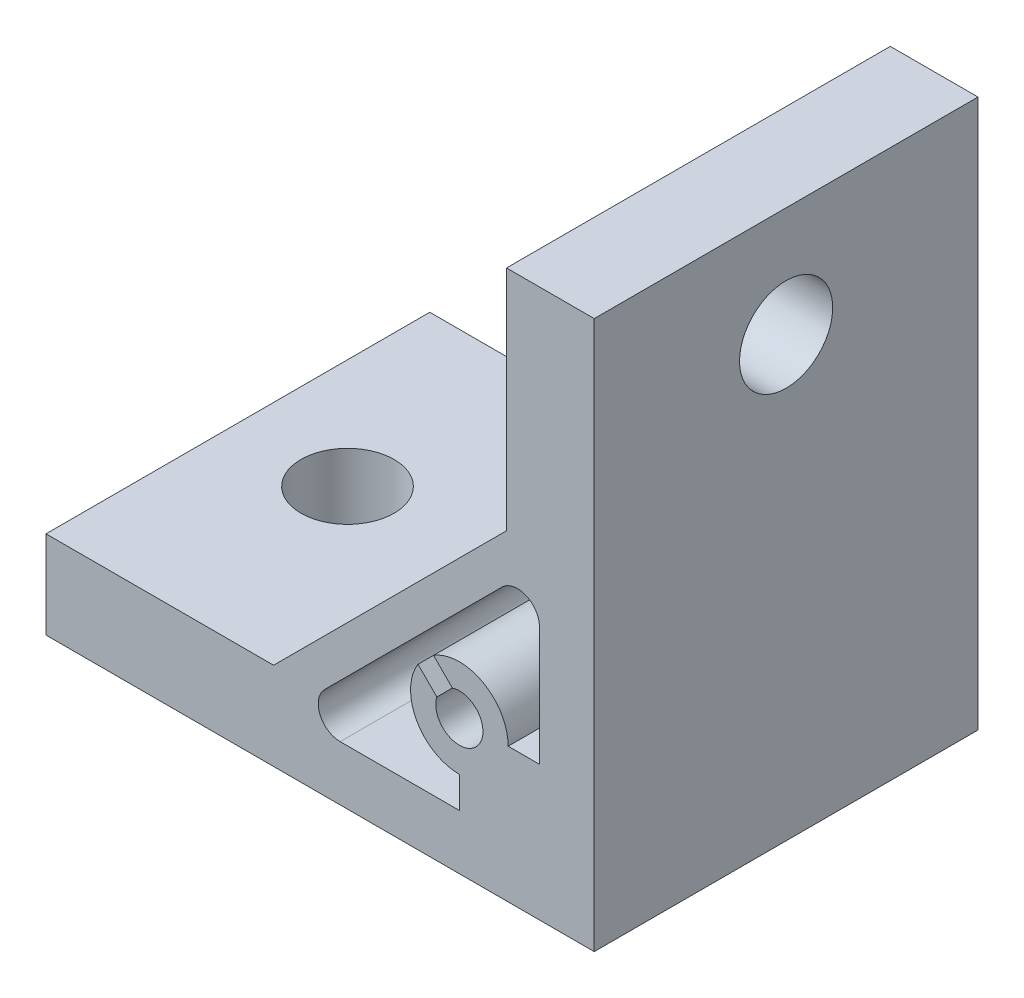
ISO-10303-21;
HEADER;
FILE_DESCRIPTION(('STEP AP214'),'2;1');
FILE_NAME('part.step','',(''),(''),'','','');
FILE_SCHEMA(('AUTOMOTIVE_DESIGN { 1 0 10303 214 1 1 1 1 }'));
ENDSEC;
DATA;
#1=APPLICATION_CONTEXT('core data for automotive mechanical design processes');
#2=APPLICATION_PROTOCOL_DEFINITION('international standard','automotive_design',2000,#1);
#3=PRODUCT_CONTEXT('',#1,'mechanical');
#4=PRODUCT('Part','Part','',(#3));
#5=PRODUCT_RELATED_PRODUCT_CATEGORY('part','',(#4));
#6=PRODUCT_DEFINITION_FORMATION('','',#4);
#7=PRODUCT_DEFINITION_CONTEXT('part definition',#1,'design');
#8=PRODUCT_DEFINITION('design','',#6,#7);
#9=PRODUCT_DEFINITION_SHAPE('','',#8);
#10=(LENGTH_UNIT() NAMED_UNIT(*) SI_UNIT(.MILLI.,.METRE.));
#11=(NAMED_UNIT(*) PLANE_ANGLE_UNIT() SI_UNIT($,.RADIAN.));
#12=(NAMED_UNIT(*) SI_UNIT($,.STERADIAN.) SOLID_ANGLE_UNIT());
#13=UNCERTAINTY_MEASURE_WITH_UNIT(LENGTH_MEASURE(1.E-05),#10,'distance_accuracy_value','');
#14=(GEOMETRIC_REPRESENTATION_CONTEXT(3) GLOBAL_UNCERTAINTY_ASSIGNED_CONTEXT((#13)) GLOBAL_UNIT_ASSIGNED_CONTEXT((#10,
#11,#12)) REPRESENTATION_CONTEXT('',''));
#15=CARTESIAN_POINT('',(0.,0.,0.));
#16=DIRECTION('',(0.,0.,1.));
#17=DIRECTION('',(1.,0.,0.));
#18=AXIS2_PLACEMENT_3D('',#15,#16,#17);
#19=CARTESIAN_POINT('',(50.,0.,17.5));
#20=DIRECTION('',(-1.,0.,0.));
#21=DIRECTION('',(0.,0.,1.));
#22=AXIS2_PLACEMENT_3D('',#19,#20,#21);
#23=PLANE('',#22);
#24=DIRECTION('',(0.,1.,0.));
#25=VECTOR('',#24,1.);
#26=CARTESIAN_POINT('',(50.,0.,-17.5));
#27=LINE('',#26,#25);
#28=CARTESIAN_POINT('',(50.,0.,-17.5));
#29=VERTEX_POINT('',#28);
#30=CARTESIAN_POINT('',(50.,50.,-17.5));
#31=VERTEX_POINT('',#30);
#32=EDGE_CURVE('E283',#29,#31,#27,.T.);
#33=ORIENTED_EDGE('',*,*,#32,.T.);
#34=DIRECTION('',(0.,0.,-1.));
#35=VECTOR('',#34,1.);
#36=CARTESIAN_POINT('',(50.,50.,17.5));
#37=LINE('',#36,#35);
#38=CARTESIAN_POINT('',(50.,50.,17.5));
#39=VERTEX_POINT('',#38);
#40=EDGE_CURVE('E303',#39,#31,#37,.T.);
#41=ORIENTED_EDGE('',*,*,#40,.F.);
#42=DIRECTION('',(0.,1.,0.));
#43=VECTOR('',#42,1.);
#44=CARTESIAN_POINT('',(50.,0.,17.5));
#45=LINE('',#44,#43);
#46=CARTESIAN_POINT('',(50.,0.,17.5));
#47=VERTEX_POINT('',#46);
#48=EDGE_CURVE('E268',#47,#39,#45,.T.);
#49=ORIENTED_EDGE('',*,*,#48,.F.);
#50=DIRECTION('',(0.,0.,-1.));
#51=VECTOR('',#50,1.);
#52=CARTESIAN_POINT('',(50.,0.,17.5));
#53=LINE('',#52,#51);
#54=EDGE_CURVE('E43',#47,#29,#53,.T.);
#55=ORIENTED_EDGE('',*,*,#54,.T.);
#56=EDGE_LOOP('',(#33,#41,#49,#55));
#57=FACE_BOUND('',#56,.T.);
#58=CARTESIAN_POINT('',(50.0000000000001,40.,0.));
#59=DIRECTION('',(1.,0.,0.));
#60=DIRECTION('',(0.,0.,1.));
#61=AXIS2_PLACEMENT_3D('',#58,#59,#60);
#62=CIRCLE('',#61,4.25);
#63=CARTESIAN_POINT('',(50.0000000000001,40.,4.25));
#64=VERTEX_POINT('',#63);
#65=EDGE_CURVE('E369',#64,#64,#62,.T.);
#66=ORIENTED_EDGE('',*,*,#65,.F.);
#67=EDGE_LOOP('',(#66));
#68=FACE_BOUND('',#67,.T.);
#69=ADVANCED_FACE('F35',(#57,#68),#23,.F.);
#70=CARTESIAN_POINT('',(42.,29.2426406871192,17.5));
#71=DIRECTION('',(1.,0.,0.));
#72=DIRECTION('',(0.,0.,-1.));
#73=AXIS2_PLACEMENT_3D('',#70,#71,#72);
#74=PLANE('',#73);
#75=DIRECTION('',(0.,-1.,0.));
#76=VECTOR('',#75,1.);
#77=CARTESIAN_POINT('',(42.,29.2426406871192,-17.5));
#78=LINE('',#77,#76);
#79=CARTESIAN_POINT('',(42.,50.,-17.5));
#80=VERTEX_POINT('',#79);
#81=CARTESIAN_POINT('',(42.,29.2426406871192,-17.5));
#82=VERTEX_POINT('',#81);
#83=EDGE_CURVE('E287',#80,#82,#78,.T.);
#84=ORIENTED_EDGE('',*,*,#83,.T.);
#85=DIRECTION('',(0.,0.,-1.));
#86=VECTOR('',#85,1.);
#87=CARTESIAN_POINT('',(42.,29.2426406871192,17.5));
#88=LINE('',#87,#86);
#89=CARTESIAN_POINT('',(42.,29.2426406871192,17.5));
#90=VERTEX_POINT('',#89);
#91=EDGE_CURVE('E297',#90,#82,#88,.T.);
#92=ORIENTED_EDGE('',*,*,#91,.F.);
#93=DIRECTION('',(0.,-1.,0.));
#94=VECTOR('',#93,1.);
#95=CARTESIAN_POINT('',(42.,29.2426406871192,17.5));
#96=LINE('',#95,#94);
#97=CARTESIAN_POINT('',(42.,50.,17.5));
#98=VERTEX_POINT('',#97);
#99=EDGE_CURVE('E272',#98,#90,#96,.T.);
#100=ORIENTED_EDGE('',*,*,#99,.F.);
#101=DIRECTION('',(0.,0.,-1.));
#102=VECTOR('',#101,1.);
#103=CARTESIAN_POINT('',(42.,50.,17.5));
#104=LINE('',#103,#102);
#105=EDGE_CURVE('E300',#98,#80,#104,.T.);
#106=ORIENTED_EDGE('',*,*,#105,.T.);
#107=EDGE_LOOP('',(#84,#92,#100,#106));
#108=FACE_BOUND('',#107,.T.);
#109=CARTESIAN_POINT('',(42.0000000000001,40.,0.));
#110=DIRECTION('',(1.,0.,0.));
#111=DIRECTION('',(0.,0.,1.));
#112=AXIS2_PLACEMENT_3D('',#109,#110,#111);
#113=CIRCLE('',#112,4.25);
#114=CARTESIAN_POINT('',(42.0000000000001,40.,4.25));
#115=VERTEX_POINT('',#114);
#116=EDGE_CURVE('E371',#115,#115,#113,.T.);
#117=ORIENTED_EDGE('',*,*,#116,.T.);
#118=EDGE_LOOP('',(#117));
#119=FACE_BOUND('',#118,.T.);
#120=ADVANCED_FACE('F326',(#108,#119),#74,.F.);
#121=CARTESIAN_POINT('',(0.,0.,17.5));
#122=DIRECTION('',(0.,0.,1.));
#123=DIRECTION('',(1.,0.,0.));
#124=AXIS2_PLACEMENT_3D('',#121,#122,#123);
#125=PLANE('',#124);
#126=DIRECTION('',(0.,-1.,0.));
#127=VECTOR('',#126,1.);
#128=CARTESIAN_POINT('',(0.,8.,17.5));
#129=LINE('',#128,#127);
#130=CARTESIAN_POINT('',(0.,8.,17.5));
#131=VERTEX_POINT('',#130);
#132=CARTESIAN_POINT('',(0.,0.,17.5));
#133=VERTEX_POINT('',#132);
#134=EDGE_CURVE('E262',#131,#133,#129,.T.);
#135=ORIENTED_EDGE('',*,*,#134,.T.);
#136=DIRECTION('',(1.,0.,0.));
#137=VECTOR('',#136,1.);
#138=CARTESIAN_POINT('',(0.,0.,17.5));
#139=LINE('',#138,#137);
#140=EDGE_CURVE('E265',#133,#47,#139,.T.);
#141=ORIENTED_EDGE('',*,*,#140,.T.);
#142=ORIENTED_EDGE('',*,*,#48,.T.);
#143=DIRECTION('',(-1.,0.,0.));
#144=VECTOR('',#143,1.);
#145=CARTESIAN_POINT('',(42.,50.,17.5));
#146=LINE('',#145,#144);
#147=EDGE_CURVE('E270',#39,#98,#146,.T.);
#148=ORIENTED_EDGE('',*,*,#147,.T.);
#149=ORIENTED_EDGE('',*,*,#99,.T.);
#150=DIRECTION('',(-0.707106781186546,-0.707106781186549,0.));
#151=VECTOR('',#150,1.);
#152=CARTESIAN_POINT('',(20.7573593128809,8.,17.5));
#153=LINE('',#152,#151);
#154=CARTESIAN_POINT('',(20.7573593128809,8.,17.5));
#155=VERTEX_POINT('',#154);
#156=EDGE_CURVE('E274',#90,#155,#153,.T.);
#157=ORIENTED_EDGE('',*,*,#156,.T.);
#158=DIRECTION('',(-1.,0.,0.));
#159=VECTOR('',#158,1.);
#160=CARTESIAN_POINT('',(0.,8.,17.5));
#161=LINE('',#160,#159);
#162=EDGE_CURVE('E276',#155,#131,#161,.T.);
#163=ORIENTED_EDGE('',*,*,#162,.T.);
#164=EDGE_LOOP('',(#135,#141,#142,#148,#149,#157,#163));
#165=FACE_BOUND('',#164,.T.);
#166=DIRECTION('',(0.707106781186549,-0.707106781186546,0.));
#167=VECTOR('',#166,1.);
#168=CARTESIAN_POINT('',(35.647066335444,12.9387201021829,17.5));
#169=LINE('',#168,#167);
#170=CARTESIAN_POINT('',(33.9267474297161,14.6590390079109,17.5));
#171=VERTEX_POINT('',#170);
#172=CARTESIAN_POINT('',(35.647066335444,12.9387201021829,17.5));
#173=VERTEX_POINT('',#172);
#174=EDGE_CURVE('E174',#171,#173,#169,.T.);
#175=ORIENTED_EDGE('',*,*,#174,.F.);
#176=CARTESIAN_POINT('',(37.7,12.3,17.5));
#177=DIRECTION('',(0.,0.,-1.));
#178=DIRECTION('',(1.,0.,0.));
#179=AXIS2_PLACEMENT_3D('',#176,#177,#178);
#180=CIRCLE('',#179,4.45);
#181=CARTESIAN_POINT('',(37.7,7.84999999999995,17.5));
#182=VERTEX_POINT('',#181);
#183=EDGE_CURVE('E166',#182,#171,#180,.T.);
#184=ORIENTED_EDGE('',*,*,#183,.F.);
#185=DIRECTION('',(0.,1.,0.));
#186=VECTOR('',#185,1.);
#187=CARTESIAN_POINT('',(37.7,5.,17.5));
#188=LINE('',#187,#186);
#189=CARTESIAN_POINT('',(37.7,5.,17.5));
#190=VERTEX_POINT('',#189);
#191=EDGE_CURVE('E209',#190,#182,#188,.T.);
#192=ORIENTED_EDGE('',*,*,#191,.F.);
#193=DIRECTION('',(1.,0.,0.));
#194=VECTOR('',#193,1.);
#195=CARTESIAN_POINT('',(26.828427124746,5.,17.5));
#196=LINE('',#195,#194);
#197=CARTESIAN_POINT('',(26.828427124746,4.99999999999993,17.5));
#198=VERTEX_POINT('',#197);
#199=EDGE_CURVE('E207',#198,#190,#196,.T.);
#200=ORIENTED_EDGE('',*,*,#199,.F.);
#201=CARTESIAN_POINT('',(26.8284271247464,7.00000000000011,17.5));
#202=DIRECTION('',(0.,0.,1.));
#203=DIRECTION('',(1.,0.,0.));
#204=AXIS2_PLACEMENT_3D('',#201,#202,#203);
#205=CIRCLE('',#204,2.00000000000019);
#206=CARTESIAN_POINT('',(25.4142135623729,8.41421356237311,17.5));
#207=VERTEX_POINT('',#206);
#208=EDGE_CURVE('E205',#207,#198,#205,.T.);
#209=ORIENTED_EDGE('',*,*,#208,.F.);
#210=DIRECTION('',(-0.70710678118655,-0.707106781186545,0.));
#211=VECTOR('',#210,1.);
#212=CARTESIAN_POINT('',(25.4142135623729,8.41421356237311,17.5));
#213=LINE('',#212,#211);
#214=CARTESIAN_POINT('',(41.585786437627,24.5857864376269,17.5));
#215=VERTEX_POINT('',#214);
#216=EDGE_CURVE('E203',#215,#207,#213,.T.);
#217=ORIENTED_EDGE('',*,*,#216,.F.);
#218=CARTESIAN_POINT('',(43.0000000000002,23.171572875254,17.5));
#219=DIRECTION('',(0.,0.,1.));
#220=DIRECTION('',(1.,0.,0.));
#221=AXIS2_PLACEMENT_3D('',#218,#219,#220);
#222=CIRCLE('',#221,1.99999999999993);
#223=CARTESIAN_POINT('',(45.,23.1715728752539,17.5));
#224=VERTEX_POINT('',#223);
#225=EDGE_CURVE('E201',#224,#215,#222,.T.);
#226=ORIENTED_EDGE('',*,*,#225,.F.);
#227=DIRECTION('',(0.,1.,0.));
#228=VECTOR('',#227,1.);
#229=CARTESIAN_POINT('',(45.,23.1715728752539,17.5));
#230=LINE('',#229,#228);
#231=CARTESIAN_POINT('',(45.,12.3,17.5));
#232=VERTEX_POINT('',#231);
#233=EDGE_CURVE('E199',#232,#224,#230,.T.);
#234=ORIENTED_EDGE('',*,*,#233,.F.);
#235=DIRECTION('',(1.,0.,0.));
#236=VECTOR('',#235,1.);
#237=CARTESIAN_POINT('',(42.15,12.3,17.5));
#238=LINE('',#237,#236);
#239=CARTESIAN_POINT('',(42.15,12.3,17.5));
#240=VERTEX_POINT('',#239);
#241=EDGE_CURVE('E197',#240,#232,#238,.T.);
#242=ORIENTED_EDGE('',*,*,#241,.F.);
#243=CARTESIAN_POINT('',(37.7,12.3,17.5));
#244=DIRECTION('',(0.,0.,-1.));
#245=DIRECTION('',(1.,0.,0.));
#246=AXIS2_PLACEMENT_3D('',#243,#244,#245);
#247=CIRCLE('',#246,4.45);
#248=CARTESIAN_POINT('',(35.3409609920885,16.0732525702836,17.5));
#249=VERTEX_POINT('',#248);
#250=EDGE_CURVE('E195',#249,#240,#247,.T.);
#251=ORIENTED_EDGE('',*,*,#250,.F.);
#252=DIRECTION('',(-0.707106781186684,0.707106781186411,0.));
#253=VECTOR('',#252,1.);
#254=CARTESIAN_POINT('',(37.0612798978168,14.3529336645559,17.5));
#255=LINE('',#254,#253);
#256=CARTESIAN_POINT('',(37.0612798978168,14.3529336645559,17.5));
#257=VERTEX_POINT('',#256);
#258=EDGE_CURVE('E190',#257,#249,#255,.T.);
#259=ORIENTED_EDGE('',*,*,#258,.F.);
#260=CARTESIAN_POINT('',(37.7,12.3,17.5));
#261=DIRECTION('',(0.,0.,1.));
#262=DIRECTION('',(1.,0.,0.));
#263=AXIS2_PLACEMENT_3D('',#260,#261,#262);
#264=CIRCLE('',#263,2.15);
#265=EDGE_CURVE('E188',#173,#257,#264,.T.);
#266=ORIENTED_EDGE('',*,*,#265,.F.);
#267=EDGE_LOOP('',(#175,#184,#192,#200,#209,#217,#226,#234,#242,#251,#259,#266));
#268=FACE_BOUND('',#267,.T.);
#269=ADVANCED_FACE('F186',(#165,#268),#125,.T.);
#270=CARTESIAN_POINT('',(0.,0.,-17.5));
#271=DIRECTION('',(0.,0.,1.));
#272=DIRECTION('',(1.,0.,0.));
#273=AXIS2_PLACEMENT_3D('',#270,#271,#272);
#274=PLANE('',#273);
#275=DIRECTION('',(0.,-1.,0.));
#276=VECTOR('',#275,1.);
#277=CARTESIAN_POINT('',(0.,8.,-17.5));
#278=LINE('',#277,#276);
#279=CARTESIAN_POINT('',(0.,8.,-17.5));
#280=VERTEX_POINT('',#279);
#281=CARTESIAN_POINT('',(0.,0.,-17.5));
#282=VERTEX_POINT('',#281);
#283=EDGE_CURVE('E182',#280,#282,#278,.T.);
#284=ORIENTED_EDGE('',*,*,#283,.F.);
#285=DIRECTION('',(-1.,0.,0.));
#286=VECTOR('',#285,1.);
#287=CARTESIAN_POINT('',(0.,8.,-17.5));
#288=LINE('',#287,#286);
#289=CARTESIAN_POINT('',(20.7573593128809,8.,-17.5));
#290=VERTEX_POINT('',#289);
#291=EDGE_CURVE('E266',#290,#280,#288,.T.);
#292=ORIENTED_EDGE('',*,*,#291,.F.);
#293=DIRECTION('',(-0.707106781186546,-0.707106781186549,0.));
#294=VECTOR('',#293,1.);
#295=CARTESIAN_POINT('',(20.7573593128809,8.,-17.5));
#296=LINE('',#295,#294);
#297=EDGE_CURVE('E289',#82,#290,#296,.T.);
#298=ORIENTED_EDGE('',*,*,#297,.F.);
#299=ORIENTED_EDGE('',*,*,#83,.F.);
#300=DIRECTION('',(-1.,0.,0.));
#301=VECTOR('',#300,1.);
#302=CARTESIAN_POINT('',(42.,50.,-17.5));
#303=LINE('',#302,#301);
#304=EDGE_CURVE('E285',#31,#80,#303,.T.);
#305=ORIENTED_EDGE('',*,*,#304,.F.);
#306=ORIENTED_EDGE('',*,*,#32,.F.);
#307=DIRECTION('',(1.,0.,0.));
#308=VECTOR('',#307,1.);
#309=CARTESIAN_POINT('',(0.,0.,-17.5));
#310=LINE('',#309,#308);
#311=EDGE_CURVE('E281',#282,#29,#310,.T.);
#312=ORIENTED_EDGE('',*,*,#311,.F.);
#313=EDGE_LOOP('',(#284,#292,#298,#299,#305,#306,#312));
#314=FACE_BOUND('',#313,.T.);
#315=CARTESIAN_POINT('',(37.7,12.3,-17.5));
#316=DIRECTION('',(0.,0.,-1.));
#317=DIRECTION('',(1.,0.,0.));
#318=AXIS2_PLACEMENT_3D('',#315,#316,#317);
#319=CIRCLE('',#318,4.45);
#320=CARTESIAN_POINT('',(37.7,7.84999999999995,-17.5));
#321=VERTEX_POINT('',#320);
#322=CARTESIAN_POINT('',(33.9267474297161,14.6590390079109,-17.5));
#323=VERTEX_POINT('',#322);
#324=EDGE_CURVE('E58',#321,#323,#319,.T.);
#325=ORIENTED_EDGE('',*,*,#324,.T.);
#326=DIRECTION('',(0.707106781186549,-0.707106781186546,0.));
#327=VECTOR('',#326,1.);
#328=CARTESIAN_POINT('',(35.647066335444,12.9387201021829,-17.5));
#329=LINE('',#328,#327);
#330=CARTESIAN_POINT('',(35.647066335444,12.9387201021829,-17.5));
#331=VERTEX_POINT('',#330);
#332=EDGE_CURVE('E181',#323,#331,#329,.T.);
#333=ORIENTED_EDGE('',*,*,#332,.T.);
#334=CARTESIAN_POINT('',(37.7,12.3,-17.5));
#335=DIRECTION('',(0.,0.,1.));
#336=DIRECTION('',(1.,0.,0.));
#337=AXIS2_PLACEMENT_3D('',#334,#335,#336);
#338=CIRCLE('',#337,2.15);
#339=CARTESIAN_POINT('',(37.0612798978168,14.3529336645559,-17.5));
#340=VERTEX_POINT('',#339);
#341=EDGE_CURVE('E214',#331,#340,#338,.T.);
#342=ORIENTED_EDGE('',*,*,#341,.T.);
#343=DIRECTION('',(-0.707106781186684,0.707106781186411,0.));
#344=VECTOR('',#343,1.);
#345=CARTESIAN_POINT('',(37.0612798978168,14.3529336645559,-17.5));
#346=LINE('',#345,#344);
#347=CARTESIAN_POINT('',(35.3409609920885,16.0732525702836,-17.5));
#348=VERTEX_POINT('',#347);
#349=EDGE_CURVE('E217',#340,#348,#346,.T.);
#350=ORIENTED_EDGE('',*,*,#349,.T.);
#351=CARTESIAN_POINT('',(37.7,12.3,-17.5));
#352=DIRECTION('',(0.,0.,-1.));
#353=DIRECTION('',(1.,0.,0.));
#354=AXIS2_PLACEMENT_3D('',#351,#352,#353);
#355=CIRCLE('',#354,4.45);
#356=CARTESIAN_POINT('',(42.15,12.3,-17.5));
#357=VERTEX_POINT('',#356);
#358=EDGE_CURVE('E220',#348,#357,#355,.T.);
#359=ORIENTED_EDGE('',*,*,#358,.T.);
#360=DIRECTION('',(1.,0.,0.));
#361=VECTOR('',#360,1.);
#362=CARTESIAN_POINT('',(42.15,12.3,-17.5));
#363=LINE('',#362,#361);
#364=CARTESIAN_POINT('',(45.,12.3,-17.5));
#365=VERTEX_POINT('',#364);
#366=EDGE_CURVE('E223',#357,#365,#363,.T.);
#367=ORIENTED_EDGE('',*,*,#366,.T.);
#368=DIRECTION('',(0.,1.,0.));
#369=VECTOR('',#368,1.);
#370=CARTESIAN_POINT('',(45.,23.1715728752539,-17.5));
#371=LINE('',#370,#369);
#372=CARTESIAN_POINT('',(45.,23.1715728752539,-17.5));
#373=VERTEX_POINT('',#372);
#374=EDGE_CURVE('E226',#365,#373,#371,.T.);
#375=ORIENTED_EDGE('',*,*,#374,.T.);
#376=CARTESIAN_POINT('',(43.0000000000002,23.171572875254,-17.5));
#377=DIRECTION('',(0.,0.,1.));
#378=DIRECTION('',(1.,0.,0.));
#379=AXIS2_PLACEMENT_3D('',#376,#377,#378);
#380=CIRCLE('',#379,1.99999999999993);
#381=CARTESIAN_POINT('',(41.585786437627,24.5857864376269,-17.5));
#382=VERTEX_POINT('',#381);
#383=EDGE_CURVE('E229',#373,#382,#380,.T.);
#384=ORIENTED_EDGE('',*,*,#383,.T.);
#385=DIRECTION('',(-0.70710678118655,-0.707106781186545,0.));
#386=VECTOR('',#385,1.);
#387=CARTESIAN_POINT('',(25.4142135623729,8.41421356237311,-17.5));
#388=LINE('',#387,#386);
#389=CARTESIAN_POINT('',(25.4142135623729,8.41421356237311,-17.5));
#390=VERTEX_POINT('',#389);
#391=EDGE_CURVE('E232',#382,#390,#388,.T.);
#392=ORIENTED_EDGE('',*,*,#391,.T.);
#393=CARTESIAN_POINT('',(26.8284271247464,7.00000000000011,-17.5));
#394=DIRECTION('',(0.,0.,1.));
#395=DIRECTION('',(1.,0.,0.));
#396=AXIS2_PLACEMENT_3D('',#393,#394,#395);
#397=CIRCLE('',#396,2.00000000000019);
#398=CARTESIAN_POINT('',(26.828427124746,4.99999999999993,-17.5));
#399=VERTEX_POINT('',#398);
#400=EDGE_CURVE('E235',#390,#399,#397,.T.);
#401=ORIENTED_EDGE('',*,*,#400,.T.);
#402=DIRECTION('',(1.,0.,0.));
#403=VECTOR('',#402,1.);
#404=CARTESIAN_POINT('',(26.828427124746,5.,-17.5));
#405=LINE('',#404,#403);
#406=CARTESIAN_POINT('',(37.7,5.,-17.5));
#407=VERTEX_POINT('',#406);
#408=EDGE_CURVE('E238',#399,#407,#405,.T.);
#409=ORIENTED_EDGE('',*,*,#408,.T.);
#410=DIRECTION('',(0.,1.,0.));
#411=VECTOR('',#410,1.);
#412=CARTESIAN_POINT('',(37.7,5.,-17.5));
#413=LINE('',#412,#411);
#414=EDGE_CURVE('E175',#407,#321,#413,.T.);
#415=ORIENTED_EDGE('',*,*,#414,.T.);
#416=EDGE_LOOP('',(#325,#333,#342,#350,#359,#367,#375,#384,#392,#401,#409,#415));
#417=FACE_BOUND('',#416,.T.);
#418=ADVANCED_FACE('F316',(#314,#417),#274,.F.);
#419=CARTESIAN_POINT('',(0.,8.,17.5));
#420=DIRECTION('',(1.,0.,0.));
#421=DIRECTION('',(0.,0.,-1.));
#422=AXIS2_PLACEMENT_3D('',#419,#420,#421);
#423=PLANE('',#422);
#424=ORIENTED_EDGE('',*,*,#283,.T.);
#425=DIRECTION('',(0.,0.,-1.));
#426=VECTOR('',#425,1.);
#427=CARTESIAN_POINT('',(0.,0.,17.5));
#428=LINE('',#427,#426);
#429=EDGE_CURVE('E11',#133,#282,#428,.T.);
#430=ORIENTED_EDGE('',*,*,#429,.F.);
#431=ORIENTED_EDGE('',*,*,#134,.F.);
#432=DIRECTION('',(0.,0.,-1.));
#433=VECTOR('',#432,1.);
#434=CARTESIAN_POINT('',(0.,8.,17.5));
#435=LINE('',#434,#433);
#436=EDGE_CURVE('E278',#131,#280,#435,.T.);
#437=ORIENTED_EDGE('',*,*,#436,.T.);
#438=EDGE_LOOP('',(#424,#430,#431,#437));
#439=FACE_BOUND('',#438,.T.);
#440=ADVANCED_FACE('F37',(#439),#423,.F.);
#441=CARTESIAN_POINT('',(0.,0.,17.5));
#442=DIRECTION('',(0.,1.,0.));
#443=DIRECTION('',(0.,0.,1.));
#444=AXIS2_PLACEMENT_3D('',#441,#442,#443);
#445=PLANE('',#444);
#446=CARTESIAN_POINT('',(10.,0.,0.));
#447=DIRECTION('',(0.,1.,0.));
#448=DIRECTION('',(0.,0.,1.));
#449=AXIS2_PLACEMENT_3D('',#446,#447,#448);
#450=CIRCLE('',#449,4.25);
#451=CARTESIAN_POINT('',(10.,0.,4.25));
#452=VERTEX_POINT('',#451);
#453=EDGE_CURVE('E212',#452,#452,#450,.T.);
#454=ORIENTED_EDGE('',*,*,#453,.T.);
#455=EDGE_LOOP('',(#454));
#456=FACE_BOUND('',#455,.T.);
#457=ORIENTED_EDGE('',*,*,#311,.T.);
#458=ORIENTED_EDGE('',*,*,#54,.F.);
#459=ORIENTED_EDGE('',*,*,#140,.F.);
#460=ORIENTED_EDGE('',*,*,#429,.T.);
#461=EDGE_LOOP('',(#457,#458,#459,#460));
#462=FACE_BOUND('',#461,.T.);
#463=ADVANCED_FACE('F334',(#456,#462),#445,.F.);
#464=CARTESIAN_POINT('',(42.,50.,17.5));
#465=DIRECTION('',(0.,-1.,0.));
#466=DIRECTION('',(0.,0.,-1.));
#467=AXIS2_PLACEMENT_3D('',#464,#465,#466);
#468=PLANE('',#467);
#469=ORIENTED_EDGE('',*,*,#304,.T.);
#470=ORIENTED_EDGE('',*,*,#105,.F.);
#471=ORIENTED_EDGE('',*,*,#147,.F.);
#472=ORIENTED_EDGE('',*,*,#40,.T.);
#473=EDGE_LOOP('',(#469,#470,#471,#472));
#474=FACE_BOUND('',#473,.T.);
#475=ADVANCED_FACE('F322',(#474),#468,.F.);
#476=CARTESIAN_POINT('',(20.7573593128809,8.,17.5));
#477=DIRECTION('',(0.707106781186549,-0.707106781186546,0.));
#478=DIRECTION('',(0.707106781186546,0.707106781186549,0.));
#479=AXIS2_PLACEMENT_3D('',#476,#477,#478);
#480=PLANE('',#479);
#481=ORIENTED_EDGE('',*,*,#297,.T.);
#482=DIRECTION('',(0.,0.,-1.));
#483=VECTOR('',#482,1.);
#484=CARTESIAN_POINT('',(20.7573593128809,8.,17.5));
#485=LINE('',#484,#483);
#486=EDGE_CURVE('E294',#155,#290,#485,.T.);
#487=ORIENTED_EDGE('',*,*,#486,.F.);
#488=ORIENTED_EDGE('',*,*,#156,.F.);
#489=ORIENTED_EDGE('',*,*,#91,.T.);
#490=EDGE_LOOP('',(#481,#487,#488,#489));
#491=FACE_BOUND('',#490,.T.);
#492=ADVANCED_FACE('F342',(#491),#480,.F.);
#493=CARTESIAN_POINT('',(0.,8.,17.5));
#494=DIRECTION('',(0.,-1.,0.));
#495=DIRECTION('',(0.,0.,-1.));
#496=AXIS2_PLACEMENT_3D('',#493,#494,#495);
#497=PLANE('',#496);
#498=CARTESIAN_POINT('',(10.,8.,0.));
#499=DIRECTION('',(0.,1.,0.));
#500=DIRECTION('',(0.,0.,1.));
#501=AXIS2_PLACEMENT_3D('',#498,#499,#500);
#502=CIRCLE('',#501,4.25);
#503=CARTESIAN_POINT('',(10.,8.,4.25));
#504=VERTEX_POINT('',#503);
#505=EDGE_CURVE('E366',#504,#504,#502,.T.);
#506=ORIENTED_EDGE('',*,*,#505,.F.);
#507=EDGE_LOOP('',(#506));
#508=FACE_BOUND('',#507,.T.);
#509=ORIENTED_EDGE('',*,*,#291,.T.);
#510=ORIENTED_EDGE('',*,*,#436,.F.);
#511=ORIENTED_EDGE('',*,*,#162,.F.);
#512=ORIENTED_EDGE('',*,*,#486,.T.);
#513=EDGE_LOOP('',(#509,#510,#511,#512));
#514=FACE_BOUND('',#513,.T.);
#515=ADVANCED_FACE('F339',(#508,#514),#497,.F.);
#516=CARTESIAN_POINT('',(37.7,12.3,17.5));
#517=DIRECTION('',(0.,0.,-1.));
#518=DIRECTION('',(-1.,0.,0.));
#519=AXIS2_PLACEMENT_3D('',#516,#517,#518);
#520=CYLINDRICAL_SURFACE('',#519,4.45);
#521=ORIENTED_EDGE('',*,*,#324,.F.);
#522=DIRECTION('',(0.,0.,-1.));
#523=VECTOR('',#522,1.);
#524=CARTESIAN_POINT('',(37.7,7.84999999999995,17.5));
#525=LINE('',#524,#523);
#526=EDGE_CURVE('E170',#182,#321,#525,.T.);
#527=ORIENTED_EDGE('',*,*,#526,.F.);
#528=ORIENTED_EDGE('',*,*,#183,.T.);
#529=DIRECTION('',(0.,0.,-1.));
#530=VECTOR('',#529,1.);
#531=CARTESIAN_POINT('',(33.9267474297161,14.6590390079109,17.5));
#532=LINE('',#531,#530);
#533=EDGE_CURVE('E169',#171,#323,#532,.T.);
#534=ORIENTED_EDGE('',*,*,#533,.T.);
#535=EDGE_LOOP('',(#521,#527,#528,#534));
#536=FACE_BOUND('',#535,.T.);
#537=ADVANCED_FACE('F168',(#536),#520,.T.);
#538=CARTESIAN_POINT('',(35.647066335444,12.9387201021829,17.5));
#539=DIRECTION('',(0.707106781186546,0.707106781186549,0.));
#540=DIRECTION('',(-0.707106781186549,0.707106781186546,0.));
#541=AXIS2_PLACEMENT_3D('',#538,#539,#540);
#542=PLANE('',#541);
#543=ORIENTED_EDGE('',*,*,#332,.F.);
#544=ORIENTED_EDGE('',*,*,#533,.F.);
#545=ORIENTED_EDGE('',*,*,#174,.T.);
#546=DIRECTION('',(0.,0.,-1.));
#547=VECTOR('',#546,1.);
#548=CARTESIAN_POINT('',(35.647066335444,12.9387201021829,17.5));
#549=LINE('',#548,#547);
#550=EDGE_CURVE('E183',#173,#331,#549,.T.);
#551=ORIENTED_EDGE('',*,*,#550,.T.);
#552=EDGE_LOOP('',(#543,#544,#545,#551));
#553=FACE_BOUND('',#552,.T.);
#554=ADVANCED_FACE('F178',(#553),#542,.T.);
#555=CARTESIAN_POINT('',(37.7,12.3,17.5));
#556=DIRECTION('',(0.,0.,-1.));
#557=DIRECTION('',(-1.,0.,0.));
#558=AXIS2_PLACEMENT_3D('',#555,#556,#557);
#559=CYLINDRICAL_SURFACE('',#558,2.15);
#560=ORIENTED_EDGE('',*,*,#341,.F.);
#561=ORIENTED_EDGE('',*,*,#550,.F.);
#562=ORIENTED_EDGE('',*,*,#265,.T.);
#563=DIRECTION('',(0.,0.,-1.));
#564=VECTOR('',#563,1.);
#565=CARTESIAN_POINT('',(37.0612798978168,14.3529336645559,17.5));
#566=LINE('',#565,#564);
#567=EDGE_CURVE('E259',#257,#340,#566,.T.);
#568=ORIENTED_EDGE('',*,*,#567,.T.);
#569=EDGE_LOOP('',(#560,#561,#562,#568));
#570=FACE_BOUND('',#569,.T.);
#571=ADVANCED_FACE('F422',(#570),#559,.F.);
#572=CARTESIAN_POINT('',(37.0612798978168,14.3529336645559,17.5));
#573=DIRECTION('',(-0.707106781186411,-0.707106781186684,0.));
#574=DIRECTION('',(0.707106781186684,-0.707106781186411,0.));
#575=AXIS2_PLACEMENT_3D('',#572,#573,#574);
#576=PLANE('',#575);
#577=ORIENTED_EDGE('',*,*,#349,.F.);
#578=ORIENTED_EDGE('',*,*,#567,.F.);
#579=ORIENTED_EDGE('',*,*,#258,.T.);
#580=DIRECTION('',(0.,0.,-1.));
#581=VECTOR('',#580,1.);
#582=CARTESIAN_POINT('',(35.3409609920885,16.0732525702836,17.5));
#583=LINE('',#582,#581);
#584=EDGE_CURVE('E257',#249,#348,#583,.T.);
#585=ORIENTED_EDGE('',*,*,#584,.T.);
#586=EDGE_LOOP('',(#577,#578,#579,#585));
#587=FACE_BOUND('',#586,.T.);
#588=ADVANCED_FACE('F418',(#587),#576,.T.);
#589=CARTESIAN_POINT('',(37.7,12.3,17.5));
#590=DIRECTION('',(0.,0.,-1.));
#591=DIRECTION('',(-1.,0.,0.));
#592=AXIS2_PLACEMENT_3D('',#589,#590,#591);
#593=CYLINDRICAL_SURFACE('',#592,4.45);
#594=ORIENTED_EDGE('',*,*,#358,.F.);
#595=ORIENTED_EDGE('',*,*,#584,.F.);
#596=ORIENTED_EDGE('',*,*,#250,.T.);
#597=DIRECTION('',(0.,0.,-1.));
#598=VECTOR('',#597,1.);
#599=CARTESIAN_POINT('',(42.15,12.3,17.5));
#600=LINE('',#599,#598);
#601=EDGE_CURVE('E255',#240,#357,#600,.T.);
#602=ORIENTED_EDGE('',*,*,#601,.T.);
#603=EDGE_LOOP('',(#594,#595,#596,#602));
#604=FACE_BOUND('',#603,.T.);
#605=ADVANCED_FACE('F414',(#604),#593,.T.);
#606=CARTESIAN_POINT('',(42.15,12.3,17.5));
#607=DIRECTION('',(0.,1.,0.));
#608=DIRECTION('',(0.,0.,1.));
#609=AXIS2_PLACEMENT_3D('',#606,#607,#608);
#610=PLANE('',#609);
#611=ORIENTED_EDGE('',*,*,#366,.F.);
#612=ORIENTED_EDGE('',*,*,#601,.F.);
#613=ORIENTED_EDGE('',*,*,#241,.T.);
#614=DIRECTION('',(0.,0.,-1.));
#615=VECTOR('',#614,1.);
#616=CARTESIAN_POINT('',(45.,12.3,17.5));
#617=LINE('',#616,#615);
#618=EDGE_CURVE('E253',#232,#365,#617,.T.);
#619=ORIENTED_EDGE('',*,*,#618,.T.);
#620=EDGE_LOOP('',(#611,#612,#613,#619));
#621=FACE_BOUND('',#620,.T.);
#622=ADVANCED_FACE('F410',(#621),#610,.T.);
#623=CARTESIAN_POINT('',(45.,23.1715728752539,17.5));
#624=DIRECTION('',(-1.,0.,0.));
#625=DIRECTION('',(0.,0.,1.));
#626=AXIS2_PLACEMENT_3D('',#623,#624,#625);
#627=PLANE('',#626);
#628=ORIENTED_EDGE('',*,*,#374,.F.);
#629=ORIENTED_EDGE('',*,*,#618,.F.);
#630=ORIENTED_EDGE('',*,*,#233,.T.);
#631=DIRECTION('',(0.,0.,-1.));
#632=VECTOR('',#631,1.);
#633=CARTESIAN_POINT('',(45.,23.1715728752539,17.5));
#634=LINE('',#633,#632);
#635=EDGE_CURVE('E251',#224,#373,#634,.T.);
#636=ORIENTED_EDGE('',*,*,#635,.T.);
#637=EDGE_LOOP('',(#628,#629,#630,#636));
#638=FACE_BOUND('',#637,.T.);
#639=ADVANCED_FACE('F406',(#638),#627,.T.);
#640=CARTESIAN_POINT('',(43.0000000000002,23.171572875254,17.5));
#641=DIRECTION('',(0.,0.,-1.));
#642=DIRECTION('',(-1.,0.,0.));
#643=AXIS2_PLACEMENT_3D('',#640,#641,#642);
#644=CYLINDRICAL_SURFACE('',#643,1.99999999999993);
#645=ORIENTED_EDGE('',*,*,#383,.F.);
#646=ORIENTED_EDGE('',*,*,#635,.F.);
#647=ORIENTED_EDGE('',*,*,#225,.T.);
#648=DIRECTION('',(0.,0.,-1.));
#649=VECTOR('',#648,1.);
#650=CARTESIAN_POINT('',(41.585786437627,24.5857864376269,17.5));
#651=LINE('',#650,#649);
#652=EDGE_CURVE('E249',#215,#382,#651,.T.);
#653=ORIENTED_EDGE('',*,*,#652,.T.);
#654=EDGE_LOOP('',(#645,#646,#647,#653));
#655=FACE_BOUND('',#654,.T.);
#656=ADVANCED_FACE('F402',(#655),#644,.F.);
#657=CARTESIAN_POINT('',(25.4142135623729,8.41421356237311,17.5));
#658=DIRECTION('',(0.707106781186545,-0.70710678118655,0.));
#659=DIRECTION('',(0.70710678118655,0.707106781186545,0.));
#660=AXIS2_PLACEMENT_3D('',#657,#658,#659);
#661=PLANE('',#660);
#662=ORIENTED_EDGE('',*,*,#391,.F.);
#663=ORIENTED_EDGE('',*,*,#652,.F.);
#664=ORIENTED_EDGE('',*,*,#216,.T.);
#665=DIRECTION('',(0.,0.,-1.));
#666=VECTOR('',#665,1.);
#667=CARTESIAN_POINT('',(25.4142135623729,8.41421356237311,17.5));
#668=LINE('',#667,#666);
#669=EDGE_CURVE('E247',#207,#390,#668,.T.);
#670=ORIENTED_EDGE('',*,*,#669,.T.);
#671=EDGE_LOOP('',(#662,#663,#664,#670));
#672=FACE_BOUND('',#671,.T.);
#673=ADVANCED_FACE('F398',(#672),#661,.T.);
#674=CARTESIAN_POINT('',(26.8284271247464,7.00000000000011,17.5));
#675=DIRECTION('',(0.,0.,-1.));
#676=DIRECTION('',(-1.,0.,0.));
#677=AXIS2_PLACEMENT_3D('',#674,#675,#676);
#678=CYLINDRICAL_SURFACE('',#677,2.00000000000019);
#679=ORIENTED_EDGE('',*,*,#400,.F.);
#680=ORIENTED_EDGE('',*,*,#669,.F.);
#681=ORIENTED_EDGE('',*,*,#208,.T.);
#682=DIRECTION('',(0.,0.,-1.));
#683=VECTOR('',#682,1.);
#684=CARTESIAN_POINT('',(26.828427124746,4.99999999999993,17.5));
#685=LINE('',#684,#683);
#686=EDGE_CURVE('E245',#198,#399,#685,.T.);
#687=ORIENTED_EDGE('',*,*,#686,.T.);
#688=EDGE_LOOP('',(#679,#680,#681,#687));
#689=FACE_BOUND('',#688,.T.);
#690=ADVANCED_FACE('F394',(#689),#678,.F.);
#691=CARTESIAN_POINT('',(26.828427124746,5.,17.5));
#692=DIRECTION('',(0.,1.,0.));
#693=DIRECTION('',(0.,0.,1.));
#694=AXIS2_PLACEMENT_3D('',#691,#692,#693);
#695=PLANE('',#694);
#696=ORIENTED_EDGE('',*,*,#408,.F.);
#697=ORIENTED_EDGE('',*,*,#686,.F.);
#698=ORIENTED_EDGE('',*,*,#199,.T.);
#699=DIRECTION('',(0.,0.,-1.));
#700=VECTOR('',#699,1.);
#701=CARTESIAN_POINT('',(37.7,5.,17.5));
#702=LINE('',#701,#700);
#703=EDGE_CURVE('E50',#190,#407,#702,.T.);
#704=ORIENTED_EDGE('',*,*,#703,.T.);
#705=EDGE_LOOP('',(#696,#697,#698,#704));
#706=FACE_BOUND('',#705,.T.);
#707=ADVANCED_FACE('F391',(#706),#695,.T.);
#708=CARTESIAN_POINT('',(37.7,5.,17.5));
#709=DIRECTION('',(-1.,0.,0.));
#710=DIRECTION('',(0.,0.,1.));
#711=AXIS2_PLACEMENT_3D('',#708,#709,#710);
#712=PLANE('',#711);
#713=ORIENTED_EDGE('',*,*,#414,.F.);
#714=ORIENTED_EDGE('',*,*,#703,.F.);
#715=ORIENTED_EDGE('',*,*,#191,.T.);
#716=ORIENTED_EDGE('',*,*,#526,.T.);
#717=EDGE_LOOP('',(#713,#714,#715,#716));
#718=FACE_BOUND('',#717,.T.);
#719=ADVANCED_FACE('F386',(#718),#712,.T.);
#720=CARTESIAN_POINT('',(10.,0.,0.));
#721=DIRECTION('',(0.,1.,0.));
#722=DIRECTION('',(0.,0.,1.));
#723=AXIS2_PLACEMENT_3D('',#720,#721,#722);
#724=CYLINDRICAL_SURFACE('',#723,4.25);
#725=ORIENTED_EDGE('',*,*,#453,.F.);
#726=EDGE_LOOP('',(#725));
#727=FACE_BOUND('',#726,.T.);
#728=ORIENTED_EDGE('',*,*,#505,.T.);
#729=EDGE_LOOP('',(#728));
#730=FACE_BOUND('',#729,.T.);
#731=ADVANCED_FACE('F380',(#727,#730),#724,.F.);
#732=CARTESIAN_POINT('',(50.0000000000001,40.,0.));
#733=DIRECTION('',(-1.,0.,0.));
#734=DIRECTION('',(0.,-1.,0.));
#735=AXIS2_PLACEMENT_3D('',#732,#733,#734);
#736=CYLINDRICAL_SURFACE('',#735,4.25);
#737=ORIENTED_EDGE('',*,*,#65,.T.);
#738=EDGE_LOOP('',(#737));
#739=FACE_BOUND('',#738,.T.);
#740=ORIENTED_EDGE('',*,*,#116,.F.);
#741=EDGE_LOOP('',(#740));
#742=FACE_BOUND('',#741,.T.);
#743=ADVANCED_FACE('F377',(#739,#742),#736,.F.);
#744=CLOSED_SHELL('',(#69,#120,#269,#418,#440,#463,#475,#492,#515,#537,#554,#571,#588,#605,#622,
#639,#656,#673,#690,#707,#719,#731,#743));
#745=MANIFOLD_SOLID_BREP('B2',#744);
#746=ADVANCED_BREP_SHAPE_REPRESENTATION('',(#18,#745),#14);
#747=SHAPE_DEFINITION_REPRESENTATION(#9,#746);
ENDSEC;
END-ISO-10303-21;
